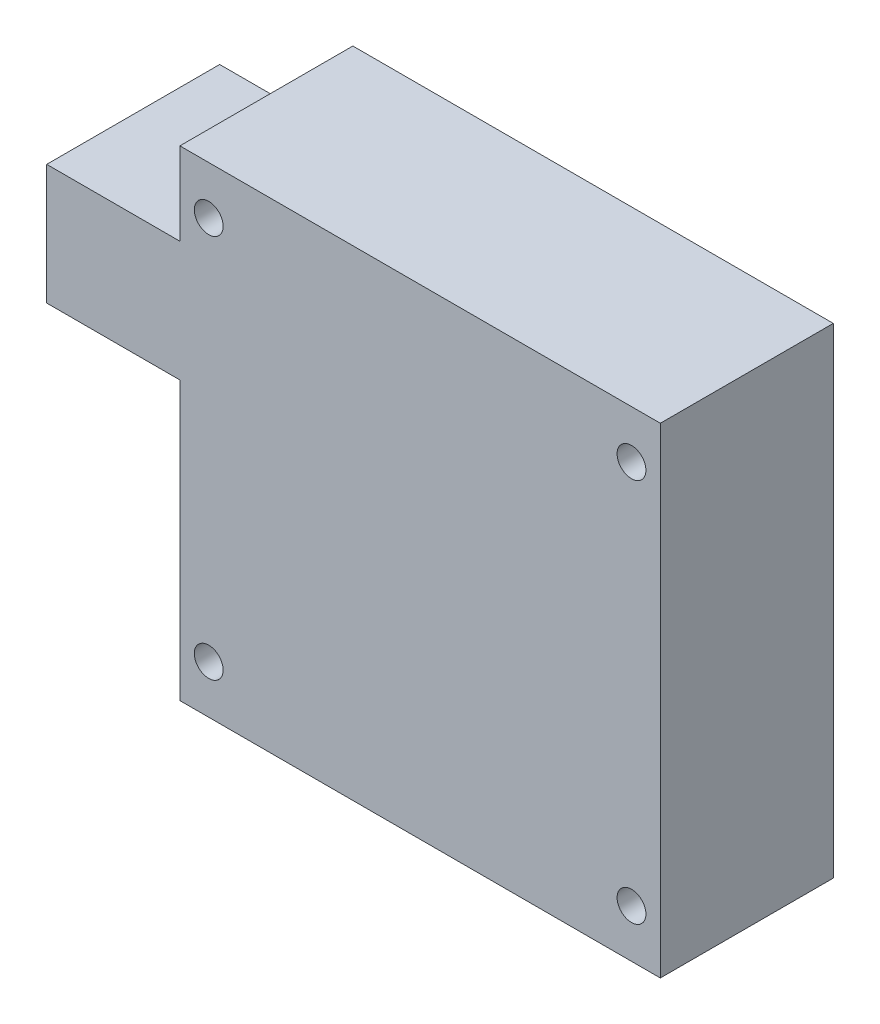
ISO-10303-21;
HEADER;
FILE_DESCRIPTION(('STEP AP214'),'2;1');
FILE_NAME('part.step','',(''),(''),'','','');
FILE_SCHEMA(('AUTOMOTIVE_DESIGN { 1 0 10303 214 1 1 1 1 }'));
ENDSEC;
DATA;
#1=APPLICATION_CONTEXT('core data for automotive mechanical design processes');
#2=APPLICATION_PROTOCOL_DEFINITION('international standard','automotive_design',2000,#1);
#3=PRODUCT_CONTEXT('',#1,'mechanical');
#4=PRODUCT('Part','Part','',(#3));
#5=PRODUCT_RELATED_PRODUCT_CATEGORY('part','',(#4));
#6=PRODUCT_DEFINITION_FORMATION('','',#4);
#7=PRODUCT_DEFINITION_CONTEXT('part definition',#1,'design');
#8=PRODUCT_DEFINITION('design','',#6,#7);
#9=PRODUCT_DEFINITION_SHAPE('','',#8);
#10=(LENGTH_UNIT() NAMED_UNIT(*) SI_UNIT(.MILLI.,.METRE.));
#11=(NAMED_UNIT(*) PLANE_ANGLE_UNIT() SI_UNIT($,.RADIAN.));
#12=(NAMED_UNIT(*) SI_UNIT($,.STERADIAN.) SOLID_ANGLE_UNIT());
#13=UNCERTAINTY_MEASURE_WITH_UNIT(LENGTH_MEASURE(1.E-05),#10,'distance_accuracy_value','');
#14=(GEOMETRIC_REPRESENTATION_CONTEXT(3) GLOBAL_UNCERTAINTY_ASSIGNED_CONTEXT((#13)) GLOBAL_UNIT_ASSIGNED_CONTEXT((#10,
#11,#12)) REPRESENTATION_CONTEXT('',''));
#15=CARTESIAN_POINT('',(0.,0.,0.));
#16=DIRECTION('',(0.,0.,1.));
#17=DIRECTION('',(1.,0.,0.));
#18=AXIS2_PLACEMENT_3D('',#15,#16,#17);
#19=CARTESIAN_POINT('',(-25.,-25.,18.));
#20=DIRECTION('',(1.,0.,0.));
#21=DIRECTION('',(0.,0.,-1.));
#22=AXIS2_PLACEMENT_3D('',#19,#20,#21);
#23=PLANE('',#22);
#24=DIRECTION('',(0.,0.,1.));
#25=VECTOR('',#24,1.);
#26=CARTESIAN_POINT('',(-25.,3.89945621914951,-18.6676502481827));
#27=LINE('',#26,#25);
#28=CARTESIAN_POINT('',(-25.,3.89945621914951,0.));
#29=VERTEX_POINT('',#28);
#30=CARTESIAN_POINT('',(-25.,3.89945621914951,18.));
#31=VERTEX_POINT('',#30);
#32=EDGE_CURVE('E60',#29,#31,#27,.T.);
#33=ORIENTED_EDGE('',*,*,#32,.F.);
#34=DIRECTION('',(0.,-1.,0.));
#35=VECTOR('',#34,1.);
#36=CARTESIAN_POINT('',(-25.,-25.,0.));
#37=LINE('',#36,#35);
#38=CARTESIAN_POINT('',(-25.,-25.,0.));
#39=VERTEX_POINT('',#38);
#40=EDGE_CURVE('E160',#29,#39,#37,.T.);
#41=ORIENTED_EDGE('',*,*,#40,.T.);
#42=DIRECTION('',(0.,0.,-1.));
#43=VECTOR('',#42,1.);
#44=CARTESIAN_POINT('',(-25.,-25.,18.));
#45=LINE('',#44,#43);
#46=CARTESIAN_POINT('',(-25.,-25.,18.));
#47=VERTEX_POINT('',#46);
#48=EDGE_CURVE('E11',#47,#39,#45,.T.);
#49=ORIENTED_EDGE('',*,*,#48,.F.);
#50=DIRECTION('',(0.,-1.,0.));
#51=VECTOR('',#50,1.);
#52=CARTESIAN_POINT('',(-25.,-25.,18.));
#53=LINE('',#52,#51);
#54=EDGE_CURVE('E165',#31,#47,#53,.T.);
#55=ORIENTED_EDGE('',*,*,#54,.F.);
#56=EDGE_LOOP('',(#33,#41,#49,#55));
#57=FACE_BOUND('',#56,.T.);
#58=ADVANCED_FACE('F37',(#57),#23,.F.);
#59=CARTESIAN_POINT('',(0.,0.,18.));
#60=DIRECTION('',(0.,0.,1.));
#61=DIRECTION('',(1.,0.,0.));
#62=AXIS2_PLACEMENT_3D('',#59,#60,#61);
#63=PLANE('',#62);
#64=CARTESIAN_POINT('',(22.,20.,18.));
#65=DIRECTION('',(0.,0.,1.));
#66=DIRECTION('',(1.,0.,0.));
#67=AXIS2_PLACEMENT_3D('',#64,#65,#66);
#68=CIRCLE('',#67,1.5);
#69=CARTESIAN_POINT('',(23.5,20.,18.));
#70=VERTEX_POINT('',#69);
#71=EDGE_CURVE('E145',#70,#70,#68,.T.);
#72=ORIENTED_EDGE('',*,*,#71,.F.);
#73=EDGE_LOOP('',(#72));
#74=FACE_BOUND('',#73,.T.);
#75=CARTESIAN_POINT('',(-22.,20.,18.));
#76=DIRECTION('',(0.,0.,1.));
#77=DIRECTION('',(1.,0.,0.));
#78=AXIS2_PLACEMENT_3D('',#75,#76,#77);
#79=CIRCLE('',#78,1.5);
#80=CARTESIAN_POINT('',(-20.5,20.,18.));
#81=VERTEX_POINT('',#80);
#82=EDGE_CURVE('E157',#81,#81,#79,.T.);
#83=ORIENTED_EDGE('',*,*,#82,.F.);
#84=EDGE_LOOP('',(#83));
#85=FACE_BOUND('',#84,.T.);
#86=CARTESIAN_POINT('',(-25.,25.,18.));
#87=VERTEX_POINT('',#86);
#88=CARTESIAN_POINT('',(-25.,16.4046089219391,18.));
#89=VERTEX_POINT('',#88);
#90=EDGE_CURVE('E126',#87,#89,#53,.T.);
#91=ORIENTED_EDGE('',*,*,#90,.T.);
#92=DIRECTION('',(-1.,0.,0.));
#93=VECTOR('',#92,1.);
#94=CARTESIAN_POINT('',(-25.,16.4046089219391,18.));
#95=LINE('',#94,#93);
#96=CARTESIAN_POINT('',(-38.8600981839375,16.4046089219391,18.));
#97=VERTEX_POINT('',#96);
#98=EDGE_CURVE('E108',#89,#97,#95,.T.);
#99=ORIENTED_EDGE('',*,*,#98,.T.);
#100=DIRECTION('',(0.,-1.,0.));
#101=VECTOR('',#100,1.);
#102=CARTESIAN_POINT('',(-38.8600981839375,16.4046089219391,18.));
#103=LINE('',#102,#101);
#104=CARTESIAN_POINT('',(-38.8600981839375,3.89945621914951,18.));
#105=VERTEX_POINT('',#104);
#106=EDGE_CURVE('E116',#97,#105,#103,.T.);
#107=ORIENTED_EDGE('',*,*,#106,.T.);
#108=DIRECTION('',(1.,0.,0.));
#109=VECTOR('',#108,1.);
#110=CARTESIAN_POINT('',(-25.,3.89945621914951,18.));
#111=LINE('',#110,#109);
#112=EDGE_CURVE('E122',#105,#31,#111,.T.);
#113=ORIENTED_EDGE('',*,*,#112,.T.);
#114=ORIENTED_EDGE('',*,*,#54,.T.);
#115=DIRECTION('',(1.,0.,0.));
#116=VECTOR('',#115,1.);
#117=CARTESIAN_POINT('',(25.,-25.,18.));
#118=LINE('',#117,#116);
#119=CARTESIAN_POINT('',(25.,-25.,18.));
#120=VERTEX_POINT('',#119);
#121=EDGE_CURVE('E164',#47,#120,#118,.T.);
#122=ORIENTED_EDGE('',*,*,#121,.T.);
#123=DIRECTION('',(0.,1.,0.));
#124=VECTOR('',#123,1.);
#125=CARTESIAN_POINT('',(25.,-25.,18.));
#126=LINE('',#125,#124);
#127=CARTESIAN_POINT('',(25.,25.,18.));
#128=VERTEX_POINT('',#127);
#129=EDGE_CURVE('E167',#120,#128,#126,.T.);
#130=ORIENTED_EDGE('',*,*,#129,.T.);
#131=DIRECTION('',(-1.,0.,0.));
#132=VECTOR('',#131,1.);
#133=CARTESIAN_POINT('',(25.,25.,18.));
#134=LINE('',#133,#132);
#135=EDGE_CURVE('E169',#128,#87,#134,.T.);
#136=ORIENTED_EDGE('',*,*,#135,.T.);
#137=EDGE_LOOP('',(#91,#99,#107,#113,#114,#122,#130,#136));
#138=FACE_BOUND('',#137,.T.);
#139=CARTESIAN_POINT('',(-22.,-20.,18.));
#140=DIRECTION('',(0.,0.,1.));
#141=DIRECTION('',(1.,0.,0.));
#142=AXIS2_PLACEMENT_3D('',#139,#140,#141);
#143=CIRCLE('',#142,1.5);
#144=CARTESIAN_POINT('',(-20.5,-20.,18.));
#145=VERTEX_POINT('',#144);
#146=EDGE_CURVE('E151',#145,#145,#143,.T.);
#147=ORIENTED_EDGE('',*,*,#146,.F.);
#148=EDGE_LOOP('',(#147));
#149=FACE_BOUND('',#148,.T.);
#150=CARTESIAN_POINT('',(22.,-20.,18.));
#151=DIRECTION('',(0.,0.,1.));
#152=DIRECTION('',(1.,0.,0.));
#153=AXIS2_PLACEMENT_3D('',#150,#151,#152);
#154=CIRCLE('',#153,1.5);
#155=CARTESIAN_POINT('',(23.5,-20.,18.));
#156=VERTEX_POINT('',#155);
#157=EDGE_CURVE('E139',#156,#156,#154,.T.);
#158=ORIENTED_EDGE('',*,*,#157,.F.);
#159=EDGE_LOOP('',(#158));
#160=FACE_BOUND('',#159,.T.);
#161=ADVANCED_FACE('F124',(#74,#85,#138,#149,#160),#63,.T.);
#162=CARTESIAN_POINT('',(0.,0.,0.));
#163=DIRECTION('',(0.,0.,1.));
#164=DIRECTION('',(1.,0.,0.));
#165=AXIS2_PLACEMENT_3D('',#162,#163,#164);
#166=PLANE('',#165);
#167=CARTESIAN_POINT('',(-25.,25.,0.));
#168=VERTEX_POINT('',#167);
#169=CARTESIAN_POINT('',(-25.,16.4046089219391,0.));
#170=VERTEX_POINT('',#169);
#171=EDGE_CURVE('E172',#168,#170,#37,.T.);
#172=ORIENTED_EDGE('',*,*,#171,.F.);
#173=DIRECTION('',(-1.,0.,0.));
#174=VECTOR('',#173,1.);
#175=CARTESIAN_POINT('',(25.,25.,0.));
#176=LINE('',#175,#174);
#177=CARTESIAN_POINT('',(25.,25.,0.));
#178=VERTEX_POINT('',#177);
#179=EDGE_CURVE('E178',#178,#168,#176,.T.);
#180=ORIENTED_EDGE('',*,*,#179,.F.);
#181=DIRECTION('',(0.,1.,0.));
#182=VECTOR('',#181,1.);
#183=CARTESIAN_POINT('',(25.,-25.,0.));
#184=LINE('',#183,#182);
#185=CARTESIAN_POINT('',(25.,-25.,0.));
#186=VERTEX_POINT('',#185);
#187=EDGE_CURVE('E176',#186,#178,#184,.T.);
#188=ORIENTED_EDGE('',*,*,#187,.F.);
#189=DIRECTION('',(1.,0.,0.));
#190=VECTOR('',#189,1.);
#191=CARTESIAN_POINT('',(25.,-25.,0.));
#192=LINE('',#191,#190);
#193=EDGE_CURVE('E174',#39,#186,#192,.T.);
#194=ORIENTED_EDGE('',*,*,#193,.F.);
#195=ORIENTED_EDGE('',*,*,#40,.F.);
#196=DIRECTION('',(-1.,0.,0.));
#197=VECTOR('',#196,1.);
#198=CARTESIAN_POINT('',(-25.,3.89945621914951,0.));
#199=LINE('',#198,#197);
#200=CARTESIAN_POINT('',(-38.8600981839375,3.89945621914951,0.));
#201=VERTEX_POINT('',#200);
#202=EDGE_CURVE('E129',#29,#201,#199,.T.);
#203=ORIENTED_EDGE('',*,*,#202,.T.);
#204=DIRECTION('',(0.,1.,0.));
#205=VECTOR('',#204,1.);
#206=CARTESIAN_POINT('',(-38.8600981839375,16.4046089219391,0.));
#207=LINE('',#206,#205);
#208=CARTESIAN_POINT('',(-38.8600981839375,16.4046089219391,0.));
#209=VERTEX_POINT('',#208);
#210=EDGE_CURVE('E134',#201,#209,#207,.T.);
#211=ORIENTED_EDGE('',*,*,#210,.T.);
#212=DIRECTION('',(1.,0.,0.));
#213=VECTOR('',#212,1.);
#214=CARTESIAN_POINT('',(-25.,16.4046089219391,0.));
#215=LINE('',#214,#213);
#216=EDGE_CURVE('E110',#209,#170,#215,.T.);
#217=ORIENTED_EDGE('',*,*,#216,.T.);
#218=EDGE_LOOP('',(#172,#180,#188,#194,#195,#203,#211,#217));
#219=FACE_BOUND('',#218,.T.);
#220=CARTESIAN_POINT('',(-22.,20.,0.));
#221=DIRECTION('',(0.,0.,1.));
#222=DIRECTION('',(1.,0.,0.));
#223=AXIS2_PLACEMENT_3D('',#220,#221,#222);
#224=CIRCLE('',#223,1.5);
#225=CARTESIAN_POINT('',(-20.5,20.,0.));
#226=VERTEX_POINT('',#225);
#227=EDGE_CURVE('E154',#226,#226,#224,.T.);
#228=ORIENTED_EDGE('',*,*,#227,.T.);
#229=EDGE_LOOP('',(#228));
#230=FACE_BOUND('',#229,.T.);
#231=CARTESIAN_POINT('',(-22.,-20.,0.));
#232=DIRECTION('',(0.,0.,1.));
#233=DIRECTION('',(1.,0.,0.));
#234=AXIS2_PLACEMENT_3D('',#231,#232,#233);
#235=CIRCLE('',#234,1.5);
#236=CARTESIAN_POINT('',(-20.5,-20.,0.));
#237=VERTEX_POINT('',#236);
#238=EDGE_CURVE('E148',#237,#237,#235,.T.);
#239=ORIENTED_EDGE('',*,*,#238,.T.);
#240=EDGE_LOOP('',(#239));
#241=FACE_BOUND('',#240,.T.);
#242=CARTESIAN_POINT('',(22.,20.,0.));
#243=DIRECTION('',(0.,0.,1.));
#244=DIRECTION('',(1.,0.,0.));
#245=AXIS2_PLACEMENT_3D('',#242,#243,#244);
#246=CIRCLE('',#245,1.5);
#247=CARTESIAN_POINT('',(23.5,20.,0.));
#248=VERTEX_POINT('',#247);
#249=EDGE_CURVE('E142',#248,#248,#246,.T.);
#250=ORIENTED_EDGE('',*,*,#249,.T.);
#251=EDGE_LOOP('',(#250));
#252=FACE_BOUND('',#251,.T.);
#253=CARTESIAN_POINT('',(22.,-20.,0.));
#254=DIRECTION('',(0.,0.,1.));
#255=DIRECTION('',(1.,0.,0.));
#256=AXIS2_PLACEMENT_3D('',#253,#254,#255);
#257=CIRCLE('',#256,1.5);
#258=CARTESIAN_POINT('',(23.5,-20.,0.));
#259=VERTEX_POINT('',#258);
#260=EDGE_CURVE('E138',#259,#259,#257,.T.);
#261=ORIENTED_EDGE('',*,*,#260,.T.);
#262=EDGE_LOOP('',(#261));
#263=FACE_BOUND('',#262,.T.);
#264=ADVANCED_FACE('F197',(#219,#230,#241,#252,#263),#166,.F.);
#265=ORIENTED_EDGE('',*,*,#171,.T.);
#266=DIRECTION('',(0.,0.,1.));
#267=VECTOR('',#266,1.);
#268=CARTESIAN_POINT('',(-25.,16.4046089219391,-18.6676502481827));
#269=LINE('',#268,#267);
#270=EDGE_CURVE('E52',#170,#89,#269,.T.);
#271=ORIENTED_EDGE('',*,*,#270,.T.);
#272=ORIENTED_EDGE('',*,*,#90,.F.);
#273=DIRECTION('',(0.,0.,-1.));
#274=VECTOR('',#273,1.);
#275=CARTESIAN_POINT('',(-25.,25.,18.));
#276=LINE('',#275,#274);
#277=EDGE_CURVE('E171',#87,#168,#276,.T.);
#278=ORIENTED_EDGE('',*,*,#277,.T.);
#279=EDGE_LOOP('',(#265,#271,#272,#278));
#280=FACE_BOUND('',#279,.T.);
#281=ADVANCED_FACE('F39',(#280),#23,.F.);
#282=CARTESIAN_POINT('',(25.,-25.,18.));
#283=DIRECTION('',(0.,1.,0.));
#284=DIRECTION('',(-1.,0.,0.));
#285=AXIS2_PLACEMENT_3D('',#282,#283,#284);
#286=PLANE('',#285);
#287=ORIENTED_EDGE('',*,*,#193,.T.);
#288=DIRECTION('',(0.,0.,-1.));
#289=VECTOR('',#288,1.);
#290=CARTESIAN_POINT('',(25.,-25.,18.));
#291=LINE('',#290,#289);
#292=EDGE_CURVE('E45',#120,#186,#291,.T.);
#293=ORIENTED_EDGE('',*,*,#292,.F.);
#294=ORIENTED_EDGE('',*,*,#121,.F.);
#295=ORIENTED_EDGE('',*,*,#48,.T.);
#296=EDGE_LOOP('',(#287,#293,#294,#295));
#297=FACE_BOUND('',#296,.T.);
#298=ADVANCED_FACE('F207',(#297),#286,.F.);
#299=CARTESIAN_POINT('',(25.,-25.,18.));
#300=DIRECTION('',(-1.,0.,0.));
#301=DIRECTION('',(0.,0.,1.));
#302=AXIS2_PLACEMENT_3D('',#299,#300,#301);
#303=PLANE('',#302);
#304=ORIENTED_EDGE('',*,*,#187,.T.);
#305=DIRECTION('',(0.,0.,-1.));
#306=VECTOR('',#305,1.);
#307=CARTESIAN_POINT('',(25.,25.,18.));
#308=LINE('',#307,#306);
#309=EDGE_CURVE('E182',#128,#178,#308,.T.);
#310=ORIENTED_EDGE('',*,*,#309,.F.);
#311=ORIENTED_EDGE('',*,*,#129,.F.);
#312=ORIENTED_EDGE('',*,*,#292,.T.);
#313=EDGE_LOOP('',(#304,#310,#311,#312));
#314=FACE_BOUND('',#313,.T.);
#315=ADVANCED_FACE('F189',(#314),#303,.F.);
#316=CARTESIAN_POINT('',(25.,25.,18.));
#317=DIRECTION('',(0.,-1.,0.));
#318=DIRECTION('',(1.,0.,0.));
#319=AXIS2_PLACEMENT_3D('',#316,#317,#318);
#320=PLANE('',#319);
#321=ORIENTED_EDGE('',*,*,#179,.T.);
#322=ORIENTED_EDGE('',*,*,#277,.F.);
#323=ORIENTED_EDGE('',*,*,#135,.F.);
#324=ORIENTED_EDGE('',*,*,#309,.T.);
#325=EDGE_LOOP('',(#321,#322,#323,#324));
#326=FACE_BOUND('',#325,.T.);
#327=ADVANCED_FACE('F201',(#326),#320,.F.);
#328=CARTESIAN_POINT('',(-22.,20.,18.));
#329=DIRECTION('',(0.,0.,-1.));
#330=DIRECTION('',(-1.,0.,0.));
#331=AXIS2_PLACEMENT_3D('',#328,#329,#330);
#332=CYLINDRICAL_SURFACE('',#331,1.5);
#333=ORIENTED_EDGE('',*,*,#82,.T.);
#334=EDGE_LOOP('',(#333));
#335=FACE_BOUND('',#334,.T.);
#336=ORIENTED_EDGE('',*,*,#227,.F.);
#337=EDGE_LOOP('',(#336));
#338=FACE_BOUND('',#337,.T.);
#339=ADVANCED_FACE('F230',(#335,#338),#332,.F.);
#340=CARTESIAN_POINT('',(-22.,-20.,18.));
#341=DIRECTION('',(0.,0.,-1.));
#342=DIRECTION('',(-1.,0.,0.));
#343=AXIS2_PLACEMENT_3D('',#340,#341,#342);
#344=CYLINDRICAL_SURFACE('',#343,1.5);
#345=ORIENTED_EDGE('',*,*,#146,.T.);
#346=EDGE_LOOP('',(#345));
#347=FACE_BOUND('',#346,.T.);
#348=ORIENTED_EDGE('',*,*,#238,.F.);
#349=EDGE_LOOP('',(#348));
#350=FACE_BOUND('',#349,.T.);
#351=ADVANCED_FACE('F246',(#347,#350),#344,.F.);
#352=CARTESIAN_POINT('',(22.,20.,18.));
#353=DIRECTION('',(0.,0.,-1.));
#354=DIRECTION('',(-1.,0.,0.));
#355=AXIS2_PLACEMENT_3D('',#352,#353,#354);
#356=CYLINDRICAL_SURFACE('',#355,1.5);
#357=ORIENTED_EDGE('',*,*,#71,.T.);
#358=EDGE_LOOP('',(#357));
#359=FACE_BOUND('',#358,.T.);
#360=ORIENTED_EDGE('',*,*,#249,.F.);
#361=EDGE_LOOP('',(#360));
#362=FACE_BOUND('',#361,.T.);
#363=ADVANCED_FACE('F253',(#359,#362),#356,.F.);
#364=CARTESIAN_POINT('',(22.,-20.,18.));
#365=DIRECTION('',(0.,0.,-1.));
#366=DIRECTION('',(-1.,0.,0.));
#367=AXIS2_PLACEMENT_3D('',#364,#365,#366);
#368=CYLINDRICAL_SURFACE('',#367,1.5);
#369=ORIENTED_EDGE('',*,*,#157,.T.);
#370=EDGE_LOOP('',(#369));
#371=FACE_BOUND('',#370,.T.);
#372=ORIENTED_EDGE('',*,*,#260,.F.);
#373=EDGE_LOOP('',(#372));
#374=FACE_BOUND('',#373,.T.);
#375=ADVANCED_FACE('F261',(#371,#374),#368,.F.);
#376=CARTESIAN_POINT('',(-25.,3.89945621914951,-18.6676502481827));
#377=DIRECTION('',(0.,-1.,0.));
#378=DIRECTION('',(0.,0.,-1.));
#379=AXIS2_PLACEMENT_3D('',#376,#377,#378);
#380=PLANE('',#379);
#381=ORIENTED_EDGE('',*,*,#202,.F.);
#382=ORIENTED_EDGE('',*,*,#32,.T.);
#383=ORIENTED_EDGE('',*,*,#112,.F.);
#384=DIRECTION('',(0.,0.,1.));
#385=VECTOR('',#384,1.);
#386=CARTESIAN_POINT('',(-38.8600981839375,3.89945621914951,-18.6676502481827));
#387=LINE('',#386,#385);
#388=EDGE_CURVE('E113',#201,#105,#387,.T.);
#389=ORIENTED_EDGE('',*,*,#388,.F.);
#390=EDGE_LOOP('',(#381,#382,#383,#389));
#391=FACE_BOUND('',#390,.T.);
#392=ADVANCED_FACE('F205',(#391),#380,.T.);
#393=CARTESIAN_POINT('',(-38.8600981839375,16.4046089219391,-18.6676502481827));
#394=DIRECTION('',(-1.,0.,0.));
#395=DIRECTION('',(0.,0.,1.));
#396=AXIS2_PLACEMENT_3D('',#393,#394,#395);
#397=PLANE('',#396);
#398=ORIENTED_EDGE('',*,*,#210,.F.);
#399=ORIENTED_EDGE('',*,*,#388,.T.);
#400=ORIENTED_EDGE('',*,*,#106,.F.);
#401=DIRECTION('',(0.,0.,1.));
#402=VECTOR('',#401,1.);
#403=CARTESIAN_POINT('',(-38.8600981839375,16.4046089219391,-18.6676502481827));
#404=LINE('',#403,#402);
#405=EDGE_CURVE('E104',#209,#97,#404,.T.);
#406=ORIENTED_EDGE('',*,*,#405,.F.);
#407=EDGE_LOOP('',(#398,#399,#400,#406));
#408=FACE_BOUND('',#407,.T.);
#409=ADVANCED_FACE('F117',(#408),#397,.T.);
#410=CARTESIAN_POINT('',(-25.,16.4046089219391,-18.6676502481827));
#411=DIRECTION('',(0.,1.,0.));
#412=DIRECTION('',(0.,0.,1.));
#413=AXIS2_PLACEMENT_3D('',#410,#411,#412);
#414=PLANE('',#413);
#415=ORIENTED_EDGE('',*,*,#216,.F.);
#416=ORIENTED_EDGE('',*,*,#405,.T.);
#417=ORIENTED_EDGE('',*,*,#98,.F.);
#418=ORIENTED_EDGE('',*,*,#270,.F.);
#419=EDGE_LOOP('',(#415,#416,#417,#418));
#420=FACE_BOUND('',#419,.T.);
#421=ADVANCED_FACE('F106',(#420),#414,.T.);
#422=CLOSED_SHELL('',(#58,#161,#264,#281,#298,#315,#327,#339,#351,#363,#375,#392,#409,#421));
#423=MANIFOLD_SOLID_BREP('B2',#422);
#424=ADVANCED_BREP_SHAPE_REPRESENTATION('',(#18,#423),#14);
#425=SHAPE_DEFINITION_REPRESENTATION(#9,#424);
ENDSEC;
END-ISO-10303-21;
